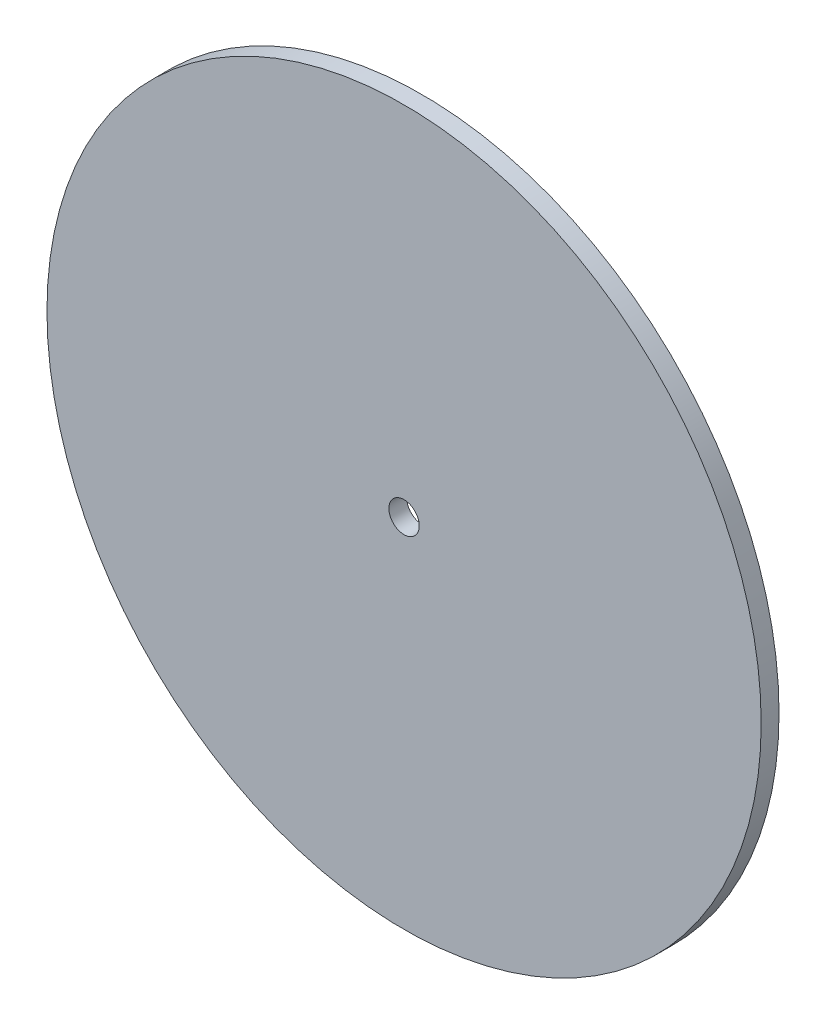
ISO-10303-21;
HEADER;
FILE_DESCRIPTION(('STEP AP214'),'2;1');
FILE_NAME('part.step','',(''),(''),'','','');
FILE_SCHEMA(('AUTOMOTIVE_DESIGN { 1 0 10303 214 1 1 1 1 }'));
ENDSEC;
DATA;
#1=APPLICATION_CONTEXT('core data for automotive mechanical design processes');
#2=APPLICATION_PROTOCOL_DEFINITION('international standard','automotive_design',2000,#1);
#3=PRODUCT_CONTEXT('',#1,'mechanical');
#4=PRODUCT('Part','Part','',(#3));
#5=PRODUCT_RELATED_PRODUCT_CATEGORY('part','',(#4));
#6=PRODUCT_DEFINITION_FORMATION('','',#4);
#7=PRODUCT_DEFINITION_CONTEXT('part definition',#1,'design');
#8=PRODUCT_DEFINITION('design','',#6,#7);
#9=PRODUCT_DEFINITION_SHAPE('','',#8);
#10=(LENGTH_UNIT() NAMED_UNIT(*) SI_UNIT(.MILLI.,.METRE.));
#11=(NAMED_UNIT(*) PLANE_ANGLE_UNIT() SI_UNIT($,.RADIAN.));
#12=(NAMED_UNIT(*) SI_UNIT($,.STERADIAN.) SOLID_ANGLE_UNIT());
#13=UNCERTAINTY_MEASURE_WITH_UNIT(LENGTH_MEASURE(1.E-05),#10,'distance_accuracy_value','');
#14=(GEOMETRIC_REPRESENTATION_CONTEXT(3) GLOBAL_UNCERTAINTY_ASSIGNED_CONTEXT((#13)) GLOBAL_UNIT_ASSIGNED_CONTEXT((#10,
#11,#12)) REPRESENTATION_CONTEXT('',''));
#15=CARTESIAN_POINT('',(0.,0.,0.));
#16=DIRECTION('',(0.,0.,1.));
#17=DIRECTION('',(1.,0.,0.));
#18=AXIS2_PLACEMENT_3D('',#15,#16,#17);
#19=CARTESIAN_POINT('',(0.,0.,1.));
#20=DIRECTION('',(0.,0.,1.));
#21=DIRECTION('',(1.,0.,0.));
#22=AXIS2_PLACEMENT_3D('',#19,#20,#21);
#23=PLANE('',#22);
#24=CARTESIAN_POINT('',(0.,0.,1.));
#25=DIRECTION('',(0.,0.,1.));
#26=DIRECTION('',(1.,0.,0.));
#27=AXIS2_PLACEMENT_3D('',#24,#25,#26);
#28=CIRCLE('',#27,20.);
#29=CARTESIAN_POINT('',(20.,0.,1.));
#30=VERTEX_POINT('',#29);
#31=EDGE_CURVE('E10',#30,#30,#28,.T.);
#32=ORIENTED_EDGE('',*,*,#31,.T.);
#33=EDGE_LOOP('',(#32));
#34=FACE_BOUND('',#33,.T.);
#35=CARTESIAN_POINT('',(0.,0.,1.));
#36=DIRECTION('',(0.,0.,1.));
#37=DIRECTION('',(1.,0.,0.));
#38=AXIS2_PLACEMENT_3D('',#35,#36,#37);
#39=CIRCLE('',#38,0.85);
#40=CARTESIAN_POINT('',(0.85,0.,1.));
#41=VERTEX_POINT('',#40);
#42=EDGE_CURVE('E42',#41,#41,#39,.T.);
#43=ORIENTED_EDGE('',*,*,#42,.F.);
#44=EDGE_LOOP('',(#43));
#45=FACE_BOUND('',#44,.T.);
#46=ADVANCED_FACE('F31',(#34,#45),#23,.T.);
#47=CARTESIAN_POINT('',(0.,0.,0.));
#48=DIRECTION('',(0.,0.,1.));
#49=DIRECTION('',(1.,0.,0.));
#50=AXIS2_PLACEMENT_3D('',#47,#48,#49);
#51=PLANE('',#50);
#52=CARTESIAN_POINT('',(0.,0.,0.));
#53=DIRECTION('',(0.,0.,1.));
#54=DIRECTION('',(1.,0.,0.));
#55=AXIS2_PLACEMENT_3D('',#52,#53,#54);
#56=CIRCLE('',#55,20.);
#57=CARTESIAN_POINT('',(20.,0.,0.));
#58=VERTEX_POINT('',#57);
#59=EDGE_CURVE('E35',#58,#58,#56,.T.);
#60=ORIENTED_EDGE('',*,*,#59,.F.);
#61=EDGE_LOOP('',(#60));
#62=FACE_BOUND('',#61,.T.);
#63=CARTESIAN_POINT('',(0.,0.,0.));
#64=DIRECTION('',(0.,0.,1.));
#65=DIRECTION('',(1.,0.,0.));
#66=AXIS2_PLACEMENT_3D('',#63,#64,#65);
#67=CIRCLE('',#66,0.85);
#68=CARTESIAN_POINT('',(0.85,0.,0.));
#69=VERTEX_POINT('',#68);
#70=EDGE_CURVE('E44',#69,#69,#67,.T.);
#71=ORIENTED_EDGE('',*,*,#70,.T.);
#72=EDGE_LOOP('',(#71));
#73=FACE_BOUND('',#72,.T.);
#74=ADVANCED_FACE('F54',(#62,#73),#51,.F.);
#75=CARTESIAN_POINT('',(0.,0.,1.));
#76=DIRECTION('',(0.,0.,-1.));
#77=DIRECTION('',(-1.,0.,0.));
#78=AXIS2_PLACEMENT_3D('',#75,#76,#77);
#79=CYLINDRICAL_SURFACE('',#78,20.);
#80=ORIENTED_EDGE('',*,*,#31,.F.);
#81=EDGE_LOOP('',(#80));
#82=FACE_BOUND('',#81,.T.);
#83=ORIENTED_EDGE('',*,*,#59,.T.);
#84=EDGE_LOOP('',(#83));
#85=FACE_BOUND('',#84,.T.);
#86=ADVANCED_FACE('F33',(#82,#85),#79,.T.);
#87=CARTESIAN_POINT('',(0.,0.,1.));
#88=DIRECTION('',(0.,0.,-1.));
#89=DIRECTION('',(-1.,0.,0.));
#90=AXIS2_PLACEMENT_3D('',#87,#88,#89);
#91=CYLINDRICAL_SURFACE('',#90,0.85);
#92=ORIENTED_EDGE('',*,*,#42,.T.);
#93=EDGE_LOOP('',(#92));
#94=FACE_BOUND('',#93,.T.);
#95=ORIENTED_EDGE('',*,*,#70,.F.);
#96=EDGE_LOOP('',(#95));
#97=FACE_BOUND('',#96,.T.);
#98=ADVANCED_FACE('F50',(#94,#97),#91,.F.);
#99=CLOSED_SHELL('',(#46,#74,#86,#98));
#100=MANIFOLD_SOLID_BREP('B2',#99);
#101=ADVANCED_BREP_SHAPE_REPRESENTATION('',(#18,#100),#14);
#102=SHAPE_DEFINITION_REPRESENTATION(#9,#101);
ENDSEC;
END-ISO-10303-21;
